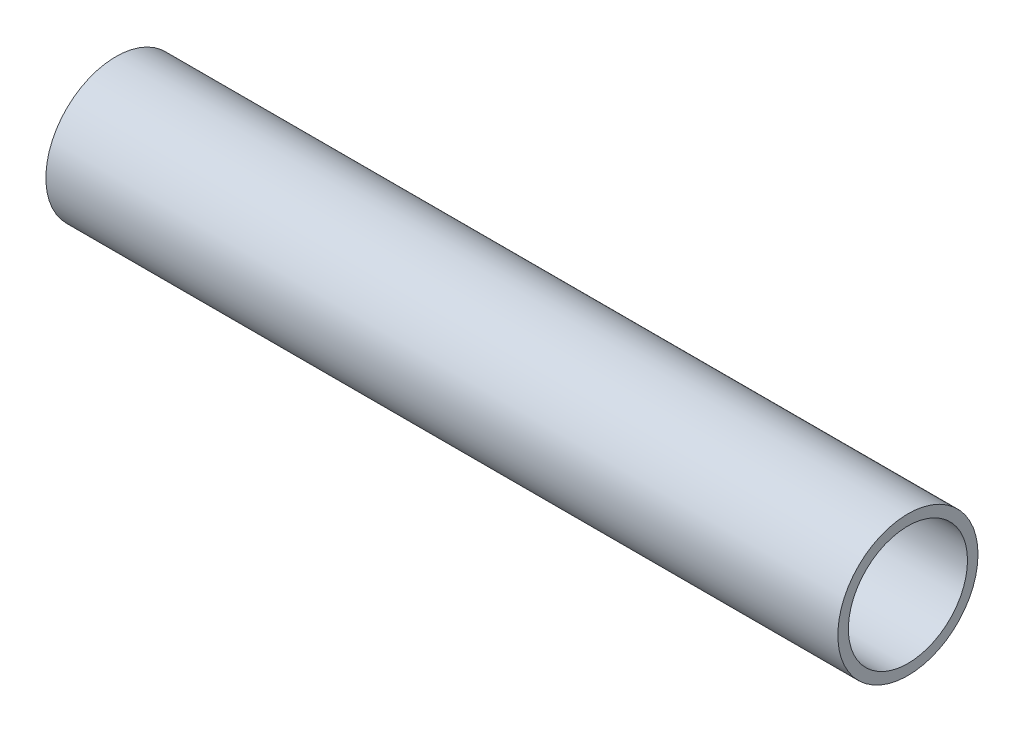
ISO-10303-21;
HEADER;
FILE_DESCRIPTION(('STEP AP214'),'2;1');
FILE_NAME('part.step','',(''),(''),'','','');
FILE_SCHEMA(('AUTOMOTIVE_DESIGN { 1 0 10303 214 1 1 1 1 }'));
ENDSEC;
DATA;
#1=APPLICATION_CONTEXT('core data for automotive mechanical design processes');
#2=APPLICATION_PROTOCOL_DEFINITION('international standard','automotive_design',2000,#1);
#3=PRODUCT_CONTEXT('',#1,'mechanical');
#4=PRODUCT('Part','Part','',(#3));
#5=PRODUCT_RELATED_PRODUCT_CATEGORY('part','',(#4));
#6=PRODUCT_DEFINITION_FORMATION('','',#4);
#7=PRODUCT_DEFINITION_CONTEXT('part definition',#1,'design');
#8=PRODUCT_DEFINITION('design','',#6,#7);
#9=PRODUCT_DEFINITION_SHAPE('','',#8);
#10=(LENGTH_UNIT() NAMED_UNIT(*) SI_UNIT(.MILLI.,.METRE.));
#11=(NAMED_UNIT(*) PLANE_ANGLE_UNIT() SI_UNIT($,.RADIAN.));
#12=(NAMED_UNIT(*) SI_UNIT($,.STERADIAN.) SOLID_ANGLE_UNIT());
#13=UNCERTAINTY_MEASURE_WITH_UNIT(LENGTH_MEASURE(1.E-05),#10,'distance_accuracy_value','');
#14=(GEOMETRIC_REPRESENTATION_CONTEXT(3) GLOBAL_UNCERTAINTY_ASSIGNED_CONTEXT((#13)) GLOBAL_UNIT_ASSIGNED_CONTEXT((#10,
#11,#12)) REPRESENTATION_CONTEXT('',''));
#15=CARTESIAN_POINT('',(0.,0.,0.));
#16=DIRECTION('',(0.,0.,1.));
#17=DIRECTION('',(1.,0.,0.));
#18=AXIS2_PLACEMENT_3D('',#15,#16,#17);
#19=CARTESIAN_POINT('',(113.,0.,0.));
#20=DIRECTION('',(1.,0.,0.));
#21=DIRECTION('',(0.,0.,-1.));
#22=AXIS2_PLACEMENT_3D('',#19,#20,#21);
#23=PLANE('',#22);
#24=CARTESIAN_POINT('',(113.,0.,0.));
#25=DIRECTION('',(1.,0.,0.));
#26=DIRECTION('',(0.,0.,-1.));
#27=AXIS2_PLACEMENT_3D('',#24,#25,#26);
#28=CIRCLE('',#27,10.);
#29=CARTESIAN_POINT('',(113.,0.,-10.));
#30=VERTEX_POINT('',#29);
#31=EDGE_CURVE('E10',#30,#30,#28,.T.);
#32=ORIENTED_EDGE('',*,*,#31,.T.);
#33=EDGE_LOOP('',(#32));
#34=FACE_BOUND('',#33,.T.);
#35=CARTESIAN_POINT('',(113.,0.,0.));
#36=DIRECTION('',(1.,0.,0.));
#37=DIRECTION('',(0.,0.,-1.));
#38=AXIS2_PLACEMENT_3D('',#35,#36,#37);
#39=CIRCLE('',#38,8.5);
#40=CARTESIAN_POINT('',(113.,0.,-8.5));
#41=VERTEX_POINT('',#40);
#42=EDGE_CURVE('E43',#41,#41,#39,.T.);
#43=ORIENTED_EDGE('',*,*,#42,.F.);
#44=EDGE_LOOP('',(#43));
#45=FACE_BOUND('',#44,.T.);
#46=ADVANCED_FACE('F32',(#34,#45),#23,.T.);
#47=CARTESIAN_POINT('',(0.,0.,0.));
#48=DIRECTION('',(1.,0.,0.));
#49=DIRECTION('',(0.,0.,-1.));
#50=AXIS2_PLACEMENT_3D('',#47,#48,#49);
#51=PLANE('',#50);
#52=CARTESIAN_POINT('',(0.,0.,0.));
#53=DIRECTION('',(1.,0.,0.));
#54=DIRECTION('',(0.,0.,-1.));
#55=AXIS2_PLACEMENT_3D('',#52,#53,#54);
#56=CIRCLE('',#55,10.);
#57=CARTESIAN_POINT('',(0.,0.,-10.));
#58=VERTEX_POINT('',#57);
#59=EDGE_CURVE('E36',#58,#58,#56,.T.);
#60=ORIENTED_EDGE('',*,*,#59,.F.);
#61=EDGE_LOOP('',(#60));
#62=FACE_BOUND('',#61,.T.);
#63=CARTESIAN_POINT('',(0.,0.,0.));
#64=DIRECTION('',(1.,0.,0.));
#65=DIRECTION('',(0.,0.,-1.));
#66=AXIS2_PLACEMENT_3D('',#63,#64,#65);
#67=CIRCLE('',#66,8.5);
#68=CARTESIAN_POINT('',(0.,0.,-8.5));
#69=VERTEX_POINT('',#68);
#70=EDGE_CURVE('E45',#69,#69,#67,.T.);
#71=ORIENTED_EDGE('',*,*,#70,.T.);
#72=EDGE_LOOP('',(#71));
#73=FACE_BOUND('',#72,.T.);
#74=ADVANCED_FACE('F55',(#62,#73),#51,.F.);
#75=CARTESIAN_POINT('',(113.,0.,0.));
#76=DIRECTION('',(-1.,0.,0.));
#77=DIRECTION('',(0.,0.,1.));
#78=AXIS2_PLACEMENT_3D('',#75,#76,#77);
#79=CYLINDRICAL_SURFACE('',#78,10.);
#80=ORIENTED_EDGE('',*,*,#31,.F.);
#81=EDGE_LOOP('',(#80));
#82=FACE_BOUND('',#81,.T.);
#83=ORIENTED_EDGE('',*,*,#59,.T.);
#84=EDGE_LOOP('',(#83));
#85=FACE_BOUND('',#84,.T.);
#86=ADVANCED_FACE('F34',(#82,#85),#79,.T.);
#87=CARTESIAN_POINT('',(113.,0.,0.));
#88=DIRECTION('',(-1.,0.,0.));
#89=DIRECTION('',(0.,0.,1.));
#90=AXIS2_PLACEMENT_3D('',#87,#88,#89);
#91=CYLINDRICAL_SURFACE('',#90,8.5);
#92=ORIENTED_EDGE('',*,*,#42,.T.);
#93=EDGE_LOOP('',(#92));
#94=FACE_BOUND('',#93,.T.);
#95=ORIENTED_EDGE('',*,*,#70,.F.);
#96=EDGE_LOOP('',(#95));
#97=FACE_BOUND('',#96,.T.);
#98=ADVANCED_FACE('F51',(#94,#97),#91,.F.);
#99=CLOSED_SHELL('',(#46,#74,#86,#98));
#100=MANIFOLD_SOLID_BREP('B2',#99);
#101=ADVANCED_BREP_SHAPE_REPRESENTATION('',(#18,#100),#14);
#102=SHAPE_DEFINITION_REPRESENTATION(#9,#101);
ENDSEC;
END-ISO-10303-21;
